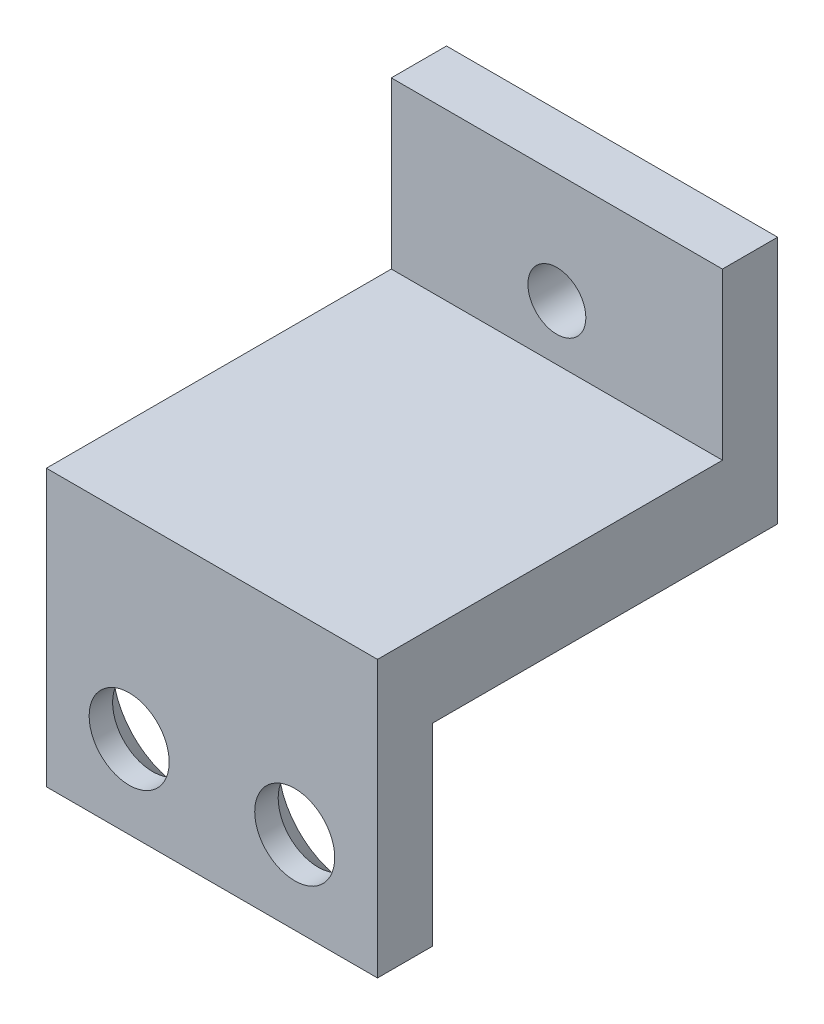
ISO-10303-21;
HEADER;
FILE_DESCRIPTION(('STEP AP214'),'2;1');
FILE_NAME('part.step','',(''),(''),'','','');
FILE_SCHEMA(('AUTOMOTIVE_DESIGN { 1 0 10303 214 1 1 1 1 }'));
ENDSEC;
DATA;
#1=APPLICATION_CONTEXT('core data for automotive mechanical design processes');
#2=APPLICATION_PROTOCOL_DEFINITION('international standard','automotive_design',2000,#1);
#3=PRODUCT_CONTEXT('',#1,'mechanical');
#4=PRODUCT('Part','Part','',(#3));
#5=PRODUCT_RELATED_PRODUCT_CATEGORY('part','',(#4));
#6=PRODUCT_DEFINITION_FORMATION('','',#4);
#7=PRODUCT_DEFINITION_CONTEXT('part definition',#1,'design');
#8=PRODUCT_DEFINITION('design','',#6,#7);
#9=PRODUCT_DEFINITION_SHAPE('','',#8);
#10=(LENGTH_UNIT() NAMED_UNIT(*) SI_UNIT(.MILLI.,.METRE.));
#11=(NAMED_UNIT(*) PLANE_ANGLE_UNIT() SI_UNIT($,.RADIAN.));
#12=(NAMED_UNIT(*) SI_UNIT($,.STERADIAN.) SOLID_ANGLE_UNIT());
#13=UNCERTAINTY_MEASURE_WITH_UNIT(LENGTH_MEASURE(1.E-05),#10,'distance_accuracy_value','');
#14=(GEOMETRIC_REPRESENTATION_CONTEXT(3) GLOBAL_UNCERTAINTY_ASSIGNED_CONTEXT((#13)) GLOBAL_UNIT_ASSIGNED_CONTEXT((#10,
#11,#12)) REPRESENTATION_CONTEXT('',''));
#15=CARTESIAN_POINT('',(0.,0.,0.));
#16=DIRECTION('',(0.,0.,1.));
#17=DIRECTION('',(1.,0.,0.));
#18=AXIS2_PLACEMENT_3D('',#15,#16,#17);
#19=CARTESIAN_POINT('',(0.,0.,-12.5));
#20=DIRECTION('',(0.,0.,-1.));
#21=DIRECTION('',(-1.,0.,0.));
#22=AXIS2_PLACEMENT_3D('',#19,#20,#21);
#23=PLANE('',#22);
#24=CARTESIAN_POINT('',(-20.,36.,-12.5));
#25=DIRECTION('',(0.,0.,1.));
#26=DIRECTION('',(1.,0.,0.));
#27=AXIS2_PLACEMENT_3D('',#24,#25,#26);
#28=CIRCLE('',#27,1.05);
#29=CARTESIAN_POINT('',(-18.95,36.,-12.5));
#30=VERTEX_POINT('',#29);
#31=EDGE_CURVE('E138',#30,#30,#28,.T.);
#32=ORIENTED_EDGE('',*,*,#31,.F.);
#33=EDGE_LOOP('',(#32));
#34=FACE_BOUND('',#33,.T.);
#35=DIRECTION('',(-1.,0.,0.));
#36=VECTOR('',#35,1.);
#37=CARTESIAN_POINT('',(0.,34.,-12.5));
#38=LINE('',#37,#36);
#39=CARTESIAN_POINT('',(-14.,34.,-12.5));
#40=VERTEX_POINT('',#39);
#41=CARTESIAN_POINT('',(-26.,34.,-12.5));
#42=VERTEX_POINT('',#41);
#43=EDGE_CURVE('E171',#40,#42,#38,.T.);
#44=ORIENTED_EDGE('',*,*,#43,.F.);
#45=DIRECTION('',(0.,1.,0.));
#46=VECTOR('',#45,1.);
#47=CARTESIAN_POINT('',(-14.,31.,-12.5));
#48=LINE('',#47,#46);
#49=CARTESIAN_POINT('',(-14.,40.,-12.5));
#50=VERTEX_POINT('',#49);
#51=EDGE_CURVE('E147',#40,#50,#48,.T.);
#52=ORIENTED_EDGE('',*,*,#51,.T.);
#53=DIRECTION('',(-1.,0.,0.));
#54=VECTOR('',#53,1.);
#55=CARTESIAN_POINT('',(-26.,40.,-12.5));
#56=LINE('',#55,#54);
#57=CARTESIAN_POINT('',(-26.,40.,-12.5));
#58=VERTEX_POINT('',#57);
#59=EDGE_CURVE('E151',#50,#58,#56,.T.);
#60=ORIENTED_EDGE('',*,*,#59,.T.);
#61=DIRECTION('',(0.,-1.,0.));
#62=VECTOR('',#61,1.);
#63=CARTESIAN_POINT('',(-26.,31.,-12.5));
#64=LINE('',#63,#62);
#65=EDGE_CURVE('E142',#58,#42,#64,.T.);
#66=ORIENTED_EDGE('',*,*,#65,.T.);
#67=EDGE_LOOP('',(#44,#52,#60,#66));
#68=FACE_BOUND('',#67,.T.);
#69=ADVANCED_FACE('F41',(#34,#68),#23,.F.);
#70=CARTESIAN_POINT('',(0.,0.,-14.5));
#71=DIRECTION('',(0.,0.,-1.));
#72=DIRECTION('',(-1.,0.,0.));
#73=AXIS2_PLACEMENT_3D('',#70,#71,#72);
#74=PLANE('',#73);
#75=DIRECTION('',(0.,-1.,0.));
#76=VECTOR('',#75,1.);
#77=CARTESIAN_POINT('',(-26.,31.,-14.5));
#78=LINE('',#77,#76);
#79=CARTESIAN_POINT('',(-26.,40.,-14.5));
#80=VERTEX_POINT('',#79);
#81=CARTESIAN_POINT('',(-26.,31.,-14.5));
#82=VERTEX_POINT('',#81);
#83=EDGE_CURVE('E145',#80,#82,#78,.T.);
#84=ORIENTED_EDGE('',*,*,#83,.F.);
#85=DIRECTION('',(-1.,0.,0.));
#86=VECTOR('',#85,1.);
#87=CARTESIAN_POINT('',(-26.,40.,-14.5));
#88=LINE('',#87,#86);
#89=CARTESIAN_POINT('',(-14.,40.,-14.5));
#90=VERTEX_POINT('',#89);
#91=EDGE_CURVE('E148',#90,#80,#88,.T.);
#92=ORIENTED_EDGE('',*,*,#91,.F.);
#93=DIRECTION('',(0.,1.,0.));
#94=VECTOR('',#93,1.);
#95=CARTESIAN_POINT('',(-14.,31.,-14.5));
#96=LINE('',#95,#94);
#97=CARTESIAN_POINT('',(-14.,31.,-14.5));
#98=VERTEX_POINT('',#97);
#99=EDGE_CURVE('E159',#98,#90,#96,.T.);
#100=ORIENTED_EDGE('',*,*,#99,.F.);
#101=DIRECTION('',(1.,0.,0.));
#102=VECTOR('',#101,1.);
#103=CARTESIAN_POINT('',(-26.,31.,-14.5));
#104=LINE('',#103,#102);
#105=EDGE_CURVE('E157',#82,#98,#104,.T.);
#106=ORIENTED_EDGE('',*,*,#105,.F.);
#107=EDGE_LOOP('',(#84,#92,#100,#106));
#108=FACE_BOUND('',#107,.T.);
#109=CARTESIAN_POINT('',(-20.,36.,-14.5));
#110=DIRECTION('',(0.,0.,1.));
#111=DIRECTION('',(1.,0.,0.));
#112=AXIS2_PLACEMENT_3D('',#109,#110,#111);
#113=CIRCLE('',#112,1.05);
#114=CARTESIAN_POINT('',(-18.95,36.,-14.5));
#115=VERTEX_POINT('',#114);
#116=EDGE_CURVE('E140',#115,#115,#113,.T.);
#117=ORIENTED_EDGE('',*,*,#116,.T.);
#118=EDGE_LOOP('',(#117));
#119=FACE_BOUND('',#118,.T.);
#120=ADVANCED_FACE('F214',(#108,#119),#74,.T.);
#121=CARTESIAN_POINT('',(-26.,31.,-12.5));
#122=DIRECTION('',(1.,0.,0.));
#123=DIRECTION('',(0.,0.,-1.));
#124=AXIS2_PLACEMENT_3D('',#121,#122,#123);
#125=PLANE('',#124);
#126=DIRECTION('',(0.,0.,-1.));
#127=VECTOR('',#126,1.);
#128=CARTESIAN_POINT('',(-26.,31.,-12.5));
#129=LINE('',#128,#127);
#130=CARTESIAN_POINT('',(-26.,31.,-2.));
#131=VERTEX_POINT('',#130);
#132=EDGE_CURVE('E169',#131,#82,#129,.T.);
#133=ORIENTED_EDGE('',*,*,#132,.F.);
#134=DIRECTION('',(0.,-1.,0.));
#135=VECTOR('',#134,1.);
#136=CARTESIAN_POINT('',(-26.,24.,-2.));
#137=LINE('',#136,#135);
#138=CARTESIAN_POINT('',(-26.,24.,-2.));
#139=VERTEX_POINT('',#138);
#140=EDGE_CURVE('E60',#131,#139,#137,.T.);
#141=ORIENTED_EDGE('',*,*,#140,.T.);
#142=DIRECTION('',(0.,0.,-1.));
#143=VECTOR('',#142,1.);
#144=CARTESIAN_POINT('',(-26.,24.,0.));
#145=LINE('',#144,#143);
#146=CARTESIAN_POINT('',(-26.,24.,0.));
#147=VERTEX_POINT('',#146);
#148=EDGE_CURVE('E115',#147,#139,#145,.T.);
#149=ORIENTED_EDGE('',*,*,#148,.F.);
#150=DIRECTION('',(0.,-1.,0.));
#151=VECTOR('',#150,1.);
#152=CARTESIAN_POINT('',(-26.,24.,0.));
#153=LINE('',#152,#151);
#154=CARTESIAN_POINT('',(-26.,34.,0.));
#155=VERTEX_POINT('',#154);
#156=EDGE_CURVE('E117',#155,#147,#153,.T.);
#157=ORIENTED_EDGE('',*,*,#156,.F.);
#158=DIRECTION('',(0.,0.,-1.));
#159=VECTOR('',#158,1.);
#160=CARTESIAN_POINT('',(-26.,34.,-1.));
#161=LINE('',#160,#159);
#162=EDGE_CURVE('E132',#155,#42,#161,.T.);
#163=ORIENTED_EDGE('',*,*,#162,.T.);
#164=ORIENTED_EDGE('',*,*,#65,.F.);
#165=DIRECTION('',(0.,0.,-1.));
#166=VECTOR('',#165,1.);
#167=CARTESIAN_POINT('',(-26.,40.,-12.5));
#168=LINE('',#167,#166);
#169=EDGE_CURVE('E153',#58,#80,#168,.T.);
#170=ORIENTED_EDGE('',*,*,#169,.T.);
#171=ORIENTED_EDGE('',*,*,#83,.T.);
#172=EDGE_LOOP('',(#133,#141,#149,#157,#163,#164,#170,#171));
#173=FACE_BOUND('',#172,.T.);
#174=ADVANCED_FACE('F129',(#173),#125,.F.);
#175=CARTESIAN_POINT('',(-26.,31.,-12.5));
#176=DIRECTION('',(0.,1.,0.));
#177=DIRECTION('',(0.,0.,1.));
#178=AXIS2_PLACEMENT_3D('',#175,#176,#177);
#179=PLANE('',#178);
#180=DIRECTION('',(0.,0.,-1.));
#181=VECTOR('',#180,1.);
#182=CARTESIAN_POINT('',(-14.,31.,-12.5));
#183=LINE('',#182,#181);
#184=CARTESIAN_POINT('',(-14.,31.,-2.));
#185=VERTEX_POINT('',#184);
#186=EDGE_CURVE('E170',#185,#98,#183,.T.);
#187=ORIENTED_EDGE('',*,*,#186,.F.);
#188=DIRECTION('',(-1.,0.,0.));
#189=VECTOR('',#188,1.);
#190=CARTESIAN_POINT('',(-26.,31.,-2.));
#191=LINE('',#190,#189);
#192=EDGE_CURVE('E172',#185,#131,#191,.T.);
#193=ORIENTED_EDGE('',*,*,#192,.T.);
#194=ORIENTED_EDGE('',*,*,#132,.T.);
#195=ORIENTED_EDGE('',*,*,#105,.T.);
#196=EDGE_LOOP('',(#187,#193,#194,#195));
#197=FACE_BOUND('',#196,.T.);
#198=ADVANCED_FACE('F204',(#197),#179,.F.);
#199=CARTESIAN_POINT('',(-14.,31.,-12.5));
#200=DIRECTION('',(-1.,0.,0.));
#201=DIRECTION('',(0.,0.,1.));
#202=AXIS2_PLACEMENT_3D('',#199,#200,#201);
#203=PLANE('',#202);
#204=DIRECTION('',(0.,1.,0.));
#205=VECTOR('',#204,1.);
#206=CARTESIAN_POINT('',(-14.,24.,-2.));
#207=LINE('',#206,#205);
#208=CARTESIAN_POINT('',(-14.,24.,-2.));
#209=VERTEX_POINT('',#208);
#210=EDGE_CURVE('E130',#209,#185,#207,.T.);
#211=ORIENTED_EDGE('',*,*,#210,.T.);
#212=ORIENTED_EDGE('',*,*,#186,.T.);
#213=ORIENTED_EDGE('',*,*,#99,.T.);
#214=DIRECTION('',(0.,0.,-1.));
#215=VECTOR('',#214,1.);
#216=CARTESIAN_POINT('',(-14.,40.,-12.5));
#217=LINE('',#216,#215);
#218=EDGE_CURVE('E163',#50,#90,#217,.T.);
#219=ORIENTED_EDGE('',*,*,#218,.F.);
#220=ORIENTED_EDGE('',*,*,#51,.F.);
#221=DIRECTION('',(0.,0.,-1.));
#222=VECTOR('',#221,1.);
#223=CARTESIAN_POINT('',(-14.,34.,-1.));
#224=LINE('',#223,#222);
#225=CARTESIAN_POINT('',(-14.,34.,0.));
#226=VERTEX_POINT('',#225);
#227=EDGE_CURVE('E62',#226,#40,#224,.T.);
#228=ORIENTED_EDGE('',*,*,#227,.F.);
#229=DIRECTION('',(0.,1.,0.));
#230=VECTOR('',#229,1.);
#231=CARTESIAN_POINT('',(-14.,24.,0.));
#232=LINE('',#231,#230);
#233=CARTESIAN_POINT('',(-14.,24.,0.));
#234=VERTEX_POINT('',#233);
#235=EDGE_CURVE('E118',#234,#226,#232,.T.);
#236=ORIENTED_EDGE('',*,*,#235,.F.);
#237=DIRECTION('',(0.,0.,-1.));
#238=VECTOR('',#237,1.);
#239=CARTESIAN_POINT('',(-14.,24.,0.));
#240=LINE('',#239,#238);
#241=EDGE_CURVE('E114',#234,#209,#240,.T.);
#242=ORIENTED_EDGE('',*,*,#241,.T.);
#243=EDGE_LOOP('',(#211,#212,#213,#219,#220,#228,#236,#242));
#244=FACE_BOUND('',#243,.T.);
#245=ADVANCED_FACE('F202',(#244),#203,.F.);
#246=CARTESIAN_POINT('',(-26.,40.,-12.5));
#247=DIRECTION('',(0.,-1.,0.));
#248=DIRECTION('',(0.,0.,-1.));
#249=AXIS2_PLACEMENT_3D('',#246,#247,#248);
#250=PLANE('',#249);
#251=ORIENTED_EDGE('',*,*,#91,.T.);
#252=ORIENTED_EDGE('',*,*,#169,.F.);
#253=ORIENTED_EDGE('',*,*,#59,.F.);
#254=ORIENTED_EDGE('',*,*,#218,.T.);
#255=EDGE_LOOP('',(#251,#252,#253,#254));
#256=FACE_BOUND('',#255,.T.);
#257=ADVANCED_FACE('F220',(#256),#250,.F.);
#258=CARTESIAN_POINT('',(-20.,36.,-12.5));
#259=DIRECTION('',(0.,0.,-1.));
#260=DIRECTION('',(-1.,0.,0.));
#261=AXIS2_PLACEMENT_3D('',#258,#259,#260);
#262=CYLINDRICAL_SURFACE('',#261,1.05);
#263=ORIENTED_EDGE('',*,*,#31,.T.);
#264=EDGE_LOOP('',(#263));
#265=FACE_BOUND('',#264,.T.);
#266=ORIENTED_EDGE('',*,*,#116,.F.);
#267=EDGE_LOOP('',(#266));
#268=FACE_BOUND('',#267,.T.);
#269=ADVANCED_FACE('F252',(#265,#268),#262,.F.);
#270=CARTESIAN_POINT('',(-26.,34.,-1.));
#271=DIRECTION('',(0.,-1.,0.));
#272=DIRECTION('',(0.,0.,-1.));
#273=AXIS2_PLACEMENT_3D('',#270,#271,#272);
#274=PLANE('',#273);
#275=ORIENTED_EDGE('',*,*,#227,.T.);
#276=ORIENTED_EDGE('',*,*,#43,.T.);
#277=ORIENTED_EDGE('',*,*,#162,.F.);
#278=DIRECTION('',(-1.,0.,0.));
#279=VECTOR('',#278,1.);
#280=CARTESIAN_POINT('',(-26.,34.,0.));
#281=LINE('',#280,#279);
#282=EDGE_CURVE('E124',#226,#155,#281,.T.);
#283=ORIENTED_EDGE('',*,*,#282,.F.);
#284=EDGE_LOOP('',(#275,#276,#277,#283));
#285=FACE_BOUND('',#284,.T.);
#286=ADVANCED_FACE('F194',(#285),#274,.F.);
#287=CARTESIAN_POINT('',(0.,0.,-2.));
#288=DIRECTION('',(0.,0.,-1.));
#289=DIRECTION('',(-1.,0.,0.));
#290=AXIS2_PLACEMENT_3D('',#287,#288,#289);
#291=PLANE('',#290);
#292=CARTESIAN_POINT('',(-23.,27.,-2.));
#293=DIRECTION('',(0.,0.,-1.));
#294=DIRECTION('',(-1.,0.,0.));
#295=AXIS2_PLACEMENT_3D('',#292,#293,#294);
#296=CIRCLE('',#295,2.6);
#297=CARTESIAN_POINT('',(-25.6,27.,-2.));
#298=VERTEX_POINT('',#297);
#299=EDGE_CURVE('E178',#298,#298,#296,.F.);
#300=ORIENTED_EDGE('',*,*,#299,.T.);
#301=EDGE_LOOP('',(#300));
#302=FACE_BOUND('',#301,.T.);
#303=CARTESIAN_POINT('',(-17.,27.,-2.));
#304=DIRECTION('',(0.,0.,-1.));
#305=DIRECTION('',(-1.,0.,0.));
#306=AXIS2_PLACEMENT_3D('',#303,#304,#305);
#307=CIRCLE('',#306,2.6);
#308=CARTESIAN_POINT('',(-19.6,27.,-2.));
#309=VERTEX_POINT('',#308);
#310=EDGE_CURVE('E174',#309,#309,#307,.F.);
#311=ORIENTED_EDGE('',*,*,#310,.T.);
#312=EDGE_LOOP('',(#311));
#313=FACE_BOUND('',#312,.T.);
#314=ORIENTED_EDGE('',*,*,#192,.F.);
#315=ORIENTED_EDGE('',*,*,#210,.F.);
#316=DIRECTION('',(1.,0.,0.));
#317=VECTOR('',#316,1.);
#318=CARTESIAN_POINT('',(-26.,24.,-2.));
#319=LINE('',#318,#317);
#320=EDGE_CURVE('E203',#139,#209,#319,.T.);
#321=ORIENTED_EDGE('',*,*,#320,.F.);
#322=ORIENTED_EDGE('',*,*,#140,.F.);
#323=EDGE_LOOP('',(#314,#315,#321,#322));
#324=FACE_BOUND('',#323,.T.);
#325=ADVANCED_FACE('F195',(#302,#313,#324),#291,.T.);
#326=CARTESIAN_POINT('',(0.,0.,0.));
#327=DIRECTION('',(0.,0.,-1.));
#328=DIRECTION('',(-1.,0.,0.));
#329=AXIS2_PLACEMENT_3D('',#326,#327,#328);
#330=PLANE('',#329);
#331=ORIENTED_EDGE('',*,*,#156,.T.);
#332=DIRECTION('',(1.,0.,0.));
#333=VECTOR('',#332,1.);
#334=CARTESIAN_POINT('',(-26.,24.,0.));
#335=LINE('',#334,#333);
#336=EDGE_CURVE('E106',#147,#234,#335,.T.);
#337=ORIENTED_EDGE('',*,*,#336,.T.);
#338=ORIENTED_EDGE('',*,*,#235,.T.);
#339=ORIENTED_EDGE('',*,*,#282,.T.);
#340=EDGE_LOOP('',(#331,#337,#338,#339));
#341=FACE_BOUND('',#340,.T.);
#342=CARTESIAN_POINT('',(-23.,27.,0.));
#343=DIRECTION('',(0.,0.,1.));
#344=DIRECTION('',(1.,0.,0.));
#345=AXIS2_PLACEMENT_3D('',#342,#343,#344);
#346=CIRCLE('',#345,1.45);
#347=CARTESIAN_POINT('',(-21.55,27.,0.));
#348=VERTEX_POINT('',#347);
#349=EDGE_CURVE('E224',#348,#348,#346,.T.);
#350=ORIENTED_EDGE('',*,*,#349,.F.);
#351=EDGE_LOOP('',(#350));
#352=FACE_BOUND('',#351,.T.);
#353=CARTESIAN_POINT('',(-17.,27.,0.));
#354=DIRECTION('',(0.,0.,1.));
#355=DIRECTION('',(1.,0.,0.));
#356=AXIS2_PLACEMENT_3D('',#353,#354,#355);
#357=CIRCLE('',#356,1.45);
#358=CARTESIAN_POINT('',(-15.55,27.,0.));
#359=VERTEX_POINT('',#358);
#360=EDGE_CURVE('E230',#359,#359,#357,.T.);
#361=ORIENTED_EDGE('',*,*,#360,.F.);
#362=EDGE_LOOP('',(#361));
#363=FACE_BOUND('',#362,.T.);
#364=ADVANCED_FACE('F123',(#341,#352,#363),#330,.F.);
#365=CARTESIAN_POINT('',(-26.,24.,0.));
#366=DIRECTION('',(0.,1.,0.));
#367=DIRECTION('',(0.,0.,1.));
#368=AXIS2_PLACEMENT_3D('',#365,#366,#367);
#369=PLANE('',#368);
#370=ORIENTED_EDGE('',*,*,#320,.T.);
#371=ORIENTED_EDGE('',*,*,#241,.F.);
#372=ORIENTED_EDGE('',*,*,#336,.F.);
#373=ORIENTED_EDGE('',*,*,#148,.T.);
#374=EDGE_LOOP('',(#370,#371,#372,#373));
#375=FACE_BOUND('',#374,.T.);
#376=ADVANCED_FACE('F109',(#375),#369,.F.);
#377=CARTESIAN_POINT('',(-23.,27.,0.));
#378=DIRECTION('',(0.,0.,-1.));
#379=DIRECTION('',(-1.,0.,0.));
#380=AXIS2_PLACEMENT_3D('',#377,#378,#379);
#381=CYLINDRICAL_SURFACE('',#380,1.45);
#382=CARTESIAN_POINT('',(-23.,27.,-0.849999999999995));
#383=DIRECTION('',(0.,0.,-1.));
#384=DIRECTION('',(-1.,0.,0.));
#385=AXIS2_PLACEMENT_3D('',#382,#383,#384);
#386=CIRCLE('',#385,1.45);
#387=CARTESIAN_POINT('',(-24.45,27.,-0.849999999999995));
#388=VERTEX_POINT('',#387);
#389=EDGE_CURVE('E49',#388,#388,#386,.T.);
#390=ORIENTED_EDGE('',*,*,#389,.T.);
#391=EDGE_LOOP('',(#390));
#392=FACE_BOUND('',#391,.T.);
#393=ORIENTED_EDGE('',*,*,#349,.T.);
#394=EDGE_LOOP('',(#393));
#395=FACE_BOUND('',#394,.T.);
#396=ADVANCED_FACE('F181',(#392,#395),#381,.F.);
#397=CARTESIAN_POINT('',(-17.,27.,0.));
#398=DIRECTION('',(0.,0.,-1.));
#399=DIRECTION('',(-1.,0.,0.));
#400=AXIS2_PLACEMENT_3D('',#397,#398,#399);
#401=CYLINDRICAL_SURFACE('',#400,1.45);
#402=CARTESIAN_POINT('',(-17.,27.,-0.849999999999995));
#403=DIRECTION('',(0.,0.,-1.));
#404=DIRECTION('',(-1.,0.,0.));
#405=AXIS2_PLACEMENT_3D('',#402,#403,#404);
#406=CIRCLE('',#405,1.45);
#407=CARTESIAN_POINT('',(-18.45,27.,-0.849999999999995));
#408=VERTEX_POINT('',#407);
#409=EDGE_CURVE('E11',#408,#408,#406,.T.);
#410=ORIENTED_EDGE('',*,*,#409,.T.);
#411=EDGE_LOOP('',(#410));
#412=FACE_BOUND('',#411,.T.);
#413=ORIENTED_EDGE('',*,*,#360,.T.);
#414=EDGE_LOOP('',(#413));
#415=FACE_BOUND('',#414,.T.);
#416=ADVANCED_FACE('F189',(#412,#415),#401,.F.);
#417=CARTESIAN_POINT('',(-23.,27.,-2.));
#418=DIRECTION('',(0.,0.,-1.));
#419=DIRECTION('',(-1.,0.,0.));
#420=AXIS2_PLACEMENT_3D('',#417,#418,#419);
#421=CONICAL_SURFACE('',#420,2.6,0.785398163397445);
#422=ORIENTED_EDGE('',*,*,#389,.F.);
#423=EDGE_LOOP('',(#422));
#424=FACE_BOUND('',#423,.T.);
#425=ORIENTED_EDGE('',*,*,#299,.F.);
#426=EDGE_LOOP('',(#425));
#427=FACE_BOUND('',#426,.T.);
#428=ADVANCED_FACE('F188',(#424,#427),#421,.F.);
#429=CARTESIAN_POINT('',(-17.,27.,-2.));
#430=DIRECTION('',(0.,0.,-1.));
#431=DIRECTION('',(-1.,0.,0.));
#432=AXIS2_PLACEMENT_3D('',#429,#430,#431);
#433=CONICAL_SURFACE('',#432,2.6,0.785398163397445);
#434=ORIENTED_EDGE('',*,*,#409,.F.);
#435=EDGE_LOOP('',(#434));
#436=FACE_BOUND('',#435,.T.);
#437=ORIENTED_EDGE('',*,*,#310,.F.);
#438=EDGE_LOOP('',(#437));
#439=FACE_BOUND('',#438,.T.);
#440=ADVANCED_FACE('F42',(#436,#439),#433,.F.);
#441=CLOSED_SHELL('',(#69,#120,#174,#198,#245,#257,#269,#286,#325,#364,#376,#396,#416,#428,#440));
#442=MANIFOLD_SOLID_BREP('B2',#441);
#443=ADVANCED_BREP_SHAPE_REPRESENTATION('',(#18,#442),#14);
#444=SHAPE_DEFINITION_REPRESENTATION(#9,#443);
ENDSEC;
END-ISO-10303-21;
